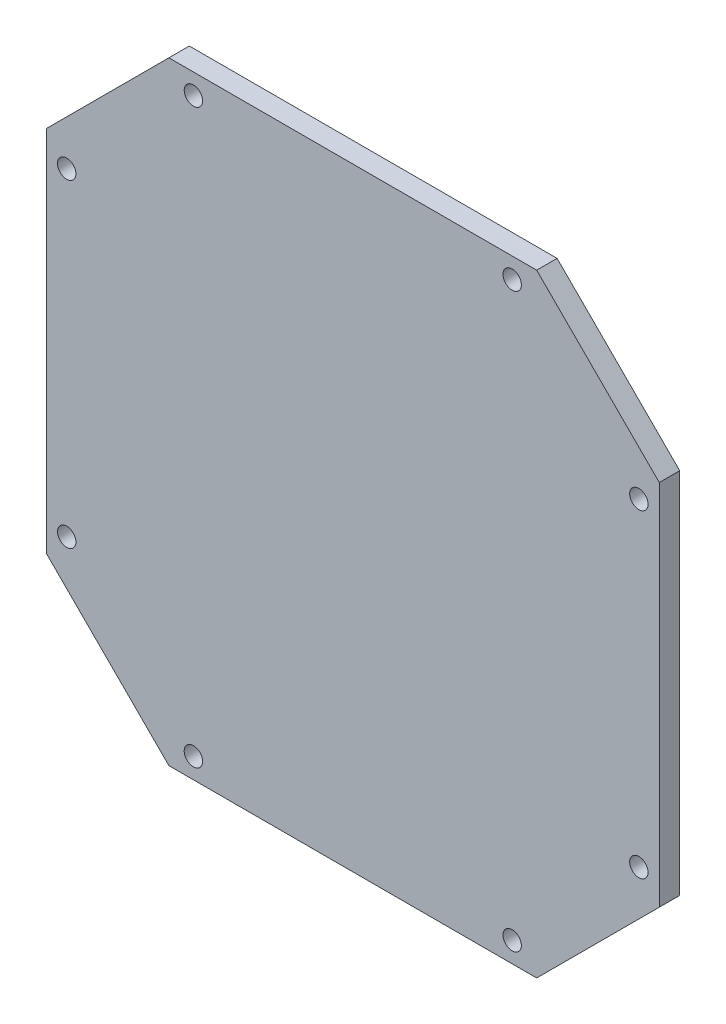
ISO-10303-21;
HEADER;
FILE_DESCRIPTION(('STEP AP214'),'2;1');
FILE_NAME('part.step','',(''),(''),'','','');
FILE_SCHEMA(('AUTOMOTIVE_DESIGN { 1 0 10303 214 1 1 1 1 }'));
ENDSEC;
DATA;
#1=APPLICATION_CONTEXT('core data for automotive mechanical design processes');
#2=APPLICATION_PROTOCOL_DEFINITION('international standard','automotive_design',2000,#1);
#3=PRODUCT_CONTEXT('',#1,'mechanical');
#4=PRODUCT('Part','Part','',(#3));
#5=PRODUCT_RELATED_PRODUCT_CATEGORY('part','',(#4));
#6=PRODUCT_DEFINITION_FORMATION('','',#4);
#7=PRODUCT_DEFINITION_CONTEXT('part definition',#1,'design');
#8=PRODUCT_DEFINITION('design','',#6,#7);
#9=PRODUCT_DEFINITION_SHAPE('','',#8);
#10=(LENGTH_UNIT() NAMED_UNIT(*) SI_UNIT(.MILLI.,.METRE.));
#11=(NAMED_UNIT(*) PLANE_ANGLE_UNIT() SI_UNIT($,.RADIAN.));
#12=(NAMED_UNIT(*) SI_UNIT($,.STERADIAN.) SOLID_ANGLE_UNIT());
#13=UNCERTAINTY_MEASURE_WITH_UNIT(LENGTH_MEASURE(1.E-05),#10,'distance_accuracy_value','');
#14=(GEOMETRIC_REPRESENTATION_CONTEXT(3) GLOBAL_UNCERTAINTY_ASSIGNED_CONTEXT((#13)) GLOBAL_UNIT_ASSIGNED_CONTEXT((#10,
#11,#12)) REPRESENTATION_CONTEXT('',''));
#15=CARTESIAN_POINT('',(0.,0.,0.));
#16=DIRECTION('',(0.,0.,1.));
#17=DIRECTION('',(1.,0.,0.));
#18=AXIS2_PLACEMENT_3D('',#15,#16,#17);
#19=CARTESIAN_POINT('',(0.,60.,10.));
#20=DIRECTION('',(1.,0.,0.));
#21=DIRECTION('',(0.,1.,0.));
#22=AXIS2_PLACEMENT_3D('',#19,#20,#21);
#23=PLANE('',#22);
#24=DIRECTION('',(0.,-1.,0.));
#25=VECTOR('',#24,1.);
#26=CARTESIAN_POINT('',(0.,60.,0.));
#27=LINE('',#26,#25);
#28=CARTESIAN_POINT('',(0.,240.,0.));
#29=VERTEX_POINT('',#28);
#30=CARTESIAN_POINT('',(0.,60.,0.));
#31=VERTEX_POINT('',#30);
#32=EDGE_CURVE('E146',#29,#31,#27,.T.);
#33=ORIENTED_EDGE('',*,*,#32,.T.);
#34=DIRECTION('',(0.,0.,-1.));
#35=VECTOR('',#34,1.);
#36=CARTESIAN_POINT('',(0.,60.,10.));
#37=LINE('',#36,#35);
#38=CARTESIAN_POINT('',(0.,60.,10.));
#39=VERTEX_POINT('',#38);
#40=EDGE_CURVE('E11',#39,#31,#37,.T.);
#41=ORIENTED_EDGE('',*,*,#40,.F.);
#42=DIRECTION('',(0.,-1.,0.));
#43=VECTOR('',#42,1.);
#44=CARTESIAN_POINT('',(0.,60.,10.));
#45=LINE('',#44,#43);
#46=CARTESIAN_POINT('',(0.,240.,10.));
#47=VERTEX_POINT('',#46);
#48=EDGE_CURVE('E169',#47,#39,#45,.T.);
#49=ORIENTED_EDGE('',*,*,#48,.F.);
#50=DIRECTION('',(0.,0.,-1.));
#51=VECTOR('',#50,1.);
#52=CARTESIAN_POINT('',(0.,240.,10.));
#53=LINE('',#52,#51);
#54=EDGE_CURVE('E142',#47,#29,#53,.T.);
#55=ORIENTED_EDGE('',*,*,#54,.T.);
#56=EDGE_LOOP('',(#33,#41,#49,#55));
#57=FACE_BOUND('',#56,.T.);
#58=ADVANCED_FACE('F45',(#57),#23,.F.);
#59=CARTESIAN_POINT('',(59.9999999999998,0.,10.));
#60=DIRECTION('',(0.707106781186548,0.707106781186546,0.));
#61=DIRECTION('',(-0.707106781186547,0.707106781186549,0.));
#62=AXIS2_PLACEMENT_3D('',#59,#60,#61);
#63=PLANE('',#62);
#64=DIRECTION('',(0.707106781186546,-0.707106781186548,0.));
#65=VECTOR('',#64,1.);
#66=CARTESIAN_POINT('',(59.9999999999998,0.,0.));
#67=LINE('',#66,#65);
#68=CARTESIAN_POINT('',(59.9999999999998,0.,0.));
#69=VERTEX_POINT('',#68);
#70=EDGE_CURVE('E150',#31,#69,#67,.T.);
#71=ORIENTED_EDGE('',*,*,#70,.T.);
#72=DIRECTION('',(0.,0.,-1.));
#73=VECTOR('',#72,1.);
#74=CARTESIAN_POINT('',(59.9999999999998,0.,10.));
#75=LINE('',#74,#73);
#76=CARTESIAN_POINT('',(59.9999999999998,0.,10.));
#77=VERTEX_POINT('',#76);
#78=EDGE_CURVE('E54',#77,#69,#75,.T.);
#79=ORIENTED_EDGE('',*,*,#78,.F.);
#80=DIRECTION('',(0.707106781186546,-0.707106781186548,0.));
#81=VECTOR('',#80,1.);
#82=CARTESIAN_POINT('',(59.9999999999998,0.,10.));
#83=LINE('',#82,#81);
#84=EDGE_CURVE('E105',#39,#77,#83,.T.);
#85=ORIENTED_EDGE('',*,*,#84,.F.);
#86=ORIENTED_EDGE('',*,*,#40,.T.);
#87=EDGE_LOOP('',(#71,#79,#85,#86));
#88=FACE_BOUND('',#87,.T.);
#89=ADVANCED_FACE('F314',(#88),#63,.F.);
#90=CARTESIAN_POINT('',(59.9999999999998,0.,10.));
#91=DIRECTION('',(0.,1.,0.));
#92=DIRECTION('',(0.,0.,1.));
#93=AXIS2_PLACEMENT_3D('',#90,#91,#92);
#94=PLANE('',#93);
#95=DIRECTION('',(1.,0.,0.));
#96=VECTOR('',#95,1.);
#97=CARTESIAN_POINT('',(59.9999999999998,0.,0.));
#98=LINE('',#97,#96);
#99=CARTESIAN_POINT('',(240.,0.,0.));
#100=VERTEX_POINT('',#99);
#101=EDGE_CURVE('E154',#69,#100,#98,.T.);
#102=ORIENTED_EDGE('',*,*,#101,.T.);
#103=DIRECTION('',(0.,0.,-1.));
#104=VECTOR('',#103,1.);
#105=CARTESIAN_POINT('',(240.,0.,10.));
#106=LINE('',#105,#104);
#107=CARTESIAN_POINT('',(240.,0.,10.));
#108=VERTEX_POINT('',#107);
#109=EDGE_CURVE('E180',#108,#100,#106,.T.);
#110=ORIENTED_EDGE('',*,*,#109,.F.);
#111=DIRECTION('',(1.,0.,0.));
#112=VECTOR('',#111,1.);
#113=CARTESIAN_POINT('',(59.9999999999998,0.,10.));
#114=LINE('',#113,#112);
#115=EDGE_CURVE('E190',#77,#108,#114,.T.);
#116=ORIENTED_EDGE('',*,*,#115,.F.);
#117=ORIENTED_EDGE('',*,*,#78,.T.);
#118=EDGE_LOOP('',(#102,#110,#116,#117));
#119=FACE_BOUND('',#118,.T.);
#120=ADVANCED_FACE('F188',(#119),#94,.F.);
#121=CARTESIAN_POINT('',(240.,0.,10.));
#122=DIRECTION('',(-0.707106781186548,0.707106781186547,0.));
#123=DIRECTION('',(-0.707106781186547,-0.707106781186548,0.));
#124=AXIS2_PLACEMENT_3D('',#121,#122,#123);
#125=PLANE('',#124);
#126=DIRECTION('',(0.707106781186547,0.707106781186548,0.));
#127=VECTOR('',#126,1.);
#128=CARTESIAN_POINT('',(240.,0.,0.));
#129=LINE('',#128,#127);
#130=CARTESIAN_POINT('',(300.,60.,0.));
#131=VERTEX_POINT('',#130);
#132=EDGE_CURVE('E157',#100,#131,#129,.T.);
#133=ORIENTED_EDGE('',*,*,#132,.T.);
#134=DIRECTION('',(0.,0.,-1.));
#135=VECTOR('',#134,1.);
#136=CARTESIAN_POINT('',(300.,60.,10.));
#137=LINE('',#136,#135);
#138=CARTESIAN_POINT('',(300.,60.,10.));
#139=VERTEX_POINT('',#138);
#140=EDGE_CURVE('E176',#139,#131,#137,.T.);
#141=ORIENTED_EDGE('',*,*,#140,.F.);
#142=DIRECTION('',(0.707106781186547,0.707106781186548,0.));
#143=VECTOR('',#142,1.);
#144=CARTESIAN_POINT('',(240.,0.,10.));
#145=LINE('',#144,#143);
#146=EDGE_CURVE('E203',#108,#139,#145,.T.);
#147=ORIENTED_EDGE('',*,*,#146,.F.);
#148=ORIENTED_EDGE('',*,*,#109,.T.);
#149=EDGE_LOOP('',(#133,#141,#147,#148));
#150=FACE_BOUND('',#149,.T.);
#151=ADVANCED_FACE('F198',(#150),#125,.F.);
#152=CARTESIAN_POINT('',(300.,60.,10.));
#153=DIRECTION('',(-1.,0.,0.));
#154=DIRECTION('',(0.,0.,1.));
#155=AXIS2_PLACEMENT_3D('',#152,#153,#154);
#156=PLANE('',#155);
#157=DIRECTION('',(0.,1.,0.));
#158=VECTOR('',#157,1.);
#159=CARTESIAN_POINT('',(300.,60.,0.));
#160=LINE('',#159,#158);
#161=CARTESIAN_POINT('',(300.,240.,0.));
#162=VERTEX_POINT('',#161);
#163=EDGE_CURVE('E160',#131,#162,#160,.T.);
#164=ORIENTED_EDGE('',*,*,#163,.T.);
#165=DIRECTION('',(0.,0.,-1.));
#166=VECTOR('',#165,1.);
#167=CARTESIAN_POINT('',(300.,240.,10.));
#168=LINE('',#167,#166);
#169=CARTESIAN_POINT('',(300.,240.,10.));
#170=VERTEX_POINT('',#169);
#171=EDGE_CURVE('E135',#170,#162,#168,.T.);
#172=ORIENTED_EDGE('',*,*,#171,.F.);
#173=DIRECTION('',(0.,1.,0.));
#174=VECTOR('',#173,1.);
#175=CARTESIAN_POINT('',(300.,60.,10.));
#176=LINE('',#175,#174);
#177=EDGE_CURVE('E124',#139,#170,#176,.T.);
#178=ORIENTED_EDGE('',*,*,#177,.F.);
#179=ORIENTED_EDGE('',*,*,#140,.T.);
#180=EDGE_LOOP('',(#164,#172,#178,#179));
#181=FACE_BOUND('',#180,.T.);
#182=ADVANCED_FACE('F201',(#181),#156,.F.);
#183=CARTESIAN_POINT('',(240.,300.,10.));
#184=DIRECTION('',(-0.707106781186546,-0.707106781186549,0.));
#185=DIRECTION('',(0.707106781186549,-0.707106781186546,0.));
#186=AXIS2_PLACEMENT_3D('',#183,#184,#185);
#187=PLANE('',#186);
#188=DIRECTION('',(-0.707106781186549,0.707106781186546,0.));
#189=VECTOR('',#188,1.);
#190=CARTESIAN_POINT('',(240.,300.,0.));
#191=LINE('',#190,#189);
#192=CARTESIAN_POINT('',(240.,300.,0.));
#193=VERTEX_POINT('',#192);
#194=EDGE_CURVE('E133',#162,#193,#191,.T.);
#195=ORIENTED_EDGE('',*,*,#194,.T.);
#196=DIRECTION('',(0.,0.,-1.));
#197=VECTOR('',#196,1.);
#198=CARTESIAN_POINT('',(240.,300.,10.));
#199=LINE('',#198,#197);
#200=CARTESIAN_POINT('',(240.,300.,10.));
#201=VERTEX_POINT('',#200);
#202=EDGE_CURVE('E130',#201,#193,#199,.T.);
#203=ORIENTED_EDGE('',*,*,#202,.F.);
#204=DIRECTION('',(-0.707106781186549,0.707106781186546,0.));
#205=VECTOR('',#204,1.);
#206=CARTESIAN_POINT('',(240.,300.,10.));
#207=LINE('',#206,#205);
#208=EDGE_CURVE('E118',#170,#201,#207,.T.);
#209=ORIENTED_EDGE('',*,*,#208,.F.);
#210=ORIENTED_EDGE('',*,*,#171,.T.);
#211=EDGE_LOOP('',(#195,#203,#209,#210));
#212=FACE_BOUND('',#211,.T.);
#213=ADVANCED_FACE('F131',(#212),#187,.F.);
#214=CARTESIAN_POINT('',(59.9999999999999,300.,10.));
#215=DIRECTION('',(0.,-1.,0.));
#216=DIRECTION('',(0.,0.,-1.));
#217=AXIS2_PLACEMENT_3D('',#214,#215,#216);
#218=PLANE('',#217);
#219=DIRECTION('',(-1.,0.,0.));
#220=VECTOR('',#219,1.);
#221=CARTESIAN_POINT('',(59.9999999999999,300.,0.));
#222=LINE('',#221,#220);
#223=CARTESIAN_POINT('',(59.9999999999999,300.,0.));
#224=VERTEX_POINT('',#223);
#225=EDGE_CURVE('E91',#193,#224,#222,.T.);
#226=ORIENTED_EDGE('',*,*,#225,.T.);
#227=DIRECTION('',(0.,0.,-1.));
#228=VECTOR('',#227,1.);
#229=CARTESIAN_POINT('',(59.9999999999999,300.,10.));
#230=LINE('',#229,#228);
#231=CARTESIAN_POINT('',(59.9999999999999,300.,10.));
#232=VERTEX_POINT('',#231);
#233=EDGE_CURVE('E136',#232,#224,#230,.T.);
#234=ORIENTED_EDGE('',*,*,#233,.F.);
#235=DIRECTION('',(-1.,0.,0.));
#236=VECTOR('',#235,1.);
#237=CARTESIAN_POINT('',(59.9999999999999,300.,10.));
#238=LINE('',#237,#236);
#239=EDGE_CURVE('E122',#201,#232,#238,.T.);
#240=ORIENTED_EDGE('',*,*,#239,.F.);
#241=ORIENTED_EDGE('',*,*,#202,.T.);
#242=EDGE_LOOP('',(#226,#234,#240,#241));
#243=FACE_BOUND('',#242,.T.);
#244=ADVANCED_FACE('F138',(#243),#218,.F.);
#245=CARTESIAN_POINT('',(0.,240.,10.));
#246=DIRECTION('',(0.707106781186547,-0.707106781186548,0.));
#247=DIRECTION('',(0.707106781186548,0.707106781186547,0.));
#248=AXIS2_PLACEMENT_3D('',#245,#246,#247);
#249=PLANE('',#248);
#250=DIRECTION('',(-0.707106781186548,-0.707106781186547,0.));
#251=VECTOR('',#250,1.);
#252=CARTESIAN_POINT('',(0.,240.,0.));
#253=LINE('',#252,#251);
#254=EDGE_CURVE('E97',#224,#29,#253,.T.);
#255=ORIENTED_EDGE('',*,*,#254,.T.);
#256=ORIENTED_EDGE('',*,*,#54,.F.);
#257=DIRECTION('',(-0.707106781186548,-0.707106781186547,0.));
#258=VECTOR('',#257,1.);
#259=CARTESIAN_POINT('',(0.,240.,10.));
#260=LINE('',#259,#258);
#261=EDGE_CURVE('E62',#232,#47,#260,.T.);
#262=ORIENTED_EDGE('',*,*,#261,.F.);
#263=ORIENTED_EDGE('',*,*,#233,.T.);
#264=EDGE_LOOP('',(#255,#256,#262,#263));
#265=FACE_BOUND('',#264,.T.);
#266=ADVANCED_FACE('F281',(#265),#249,.F.);
#267=CARTESIAN_POINT('',(0.,0.,10.));
#268=DIRECTION('',(0.,0.,-1.));
#269=DIRECTION('',(-1.,0.,0.));
#270=AXIS2_PLACEMENT_3D('',#267,#268,#269);
#271=PLANE('',#270);
#272=CARTESIAN_POINT('',(10.,72.,10.));
#273=DIRECTION('',(0.,0.,1.));
#274=DIRECTION('',(1.,0.,0.));
#275=AXIS2_PLACEMENT_3D('',#272,#273,#274);
#276=CIRCLE('',#275,4.5);
#277=CARTESIAN_POINT('',(14.5,72.,10.));
#278=VERTEX_POINT('',#277);
#279=EDGE_CURVE('E272',#278,#278,#276,.T.);
#280=ORIENTED_EDGE('',*,*,#279,.F.);
#281=EDGE_LOOP('',(#280));
#282=FACE_BOUND('',#281,.T.);
#283=CARTESIAN_POINT('',(290.,72.,10.));
#284=DIRECTION('',(0.,0.,1.));
#285=DIRECTION('',(1.,0.,0.));
#286=AXIS2_PLACEMENT_3D('',#283,#284,#285);
#287=CIRCLE('',#286,4.5);
#288=CARTESIAN_POINT('',(294.5,72.,10.));
#289=VERTEX_POINT('',#288);
#290=EDGE_CURVE('E264',#289,#289,#287,.T.);
#291=ORIENTED_EDGE('',*,*,#290,.F.);
#292=EDGE_LOOP('',(#291));
#293=FACE_BOUND('',#292,.T.);
#294=CARTESIAN_POINT('',(228.,10.,10.));
#295=DIRECTION('',(0.,0.,1.));
#296=DIRECTION('',(1.,0.,0.));
#297=AXIS2_PLACEMENT_3D('',#294,#295,#296);
#298=CIRCLE('',#297,4.5);
#299=CARTESIAN_POINT('',(232.5,10.,10.));
#300=VERTEX_POINT('',#299);
#301=EDGE_CURVE('E256',#300,#300,#298,.T.);
#302=ORIENTED_EDGE('',*,*,#301,.F.);
#303=EDGE_LOOP('',(#302));
#304=FACE_BOUND('',#303,.T.);
#305=CARTESIAN_POINT('',(72.,10.,10.));
#306=DIRECTION('',(0.,0.,1.));
#307=DIRECTION('',(1.,0.,0.));
#308=AXIS2_PLACEMENT_3D('',#305,#306,#307);
#309=CIRCLE('',#308,4.5);
#310=CARTESIAN_POINT('',(76.5,10.,10.));
#311=VERTEX_POINT('',#310);
#312=EDGE_CURVE('E248',#311,#311,#309,.T.);
#313=ORIENTED_EDGE('',*,*,#312,.F.);
#314=EDGE_LOOP('',(#313));
#315=FACE_BOUND('',#314,.T.);
#316=CARTESIAN_POINT('',(10.,228.,10.));
#317=DIRECTION('',(0.,0.,1.));
#318=DIRECTION('',(1.,0.,0.));
#319=AXIS2_PLACEMENT_3D('',#316,#317,#318);
#320=CIRCLE('',#319,4.5);
#321=CARTESIAN_POINT('',(14.5,228.,10.));
#322=VERTEX_POINT('',#321);
#323=EDGE_CURVE('E240',#322,#322,#320,.T.);
#324=ORIENTED_EDGE('',*,*,#323,.F.);
#325=EDGE_LOOP('',(#324));
#326=FACE_BOUND('',#325,.T.);
#327=CARTESIAN_POINT('',(290.,228.,10.));
#328=DIRECTION('',(0.,0.,1.));
#329=DIRECTION('',(1.,0.,0.));
#330=AXIS2_PLACEMENT_3D('',#327,#328,#329);
#331=CIRCLE('',#330,4.5);
#332=CARTESIAN_POINT('',(294.5,228.,10.));
#333=VERTEX_POINT('',#332);
#334=EDGE_CURVE('E232',#333,#333,#331,.T.);
#335=ORIENTED_EDGE('',*,*,#334,.F.);
#336=EDGE_LOOP('',(#335));
#337=FACE_BOUND('',#336,.T.);
#338=CARTESIAN_POINT('',(228.,290.,10.));
#339=DIRECTION('',(0.,0.,1.));
#340=DIRECTION('',(1.,0.,0.));
#341=AXIS2_PLACEMENT_3D('',#338,#339,#340);
#342=CIRCLE('',#341,4.5);
#343=CARTESIAN_POINT('',(232.5,290.,10.));
#344=VERTEX_POINT('',#343);
#345=EDGE_CURVE('E224',#344,#344,#342,.T.);
#346=ORIENTED_EDGE('',*,*,#345,.F.);
#347=EDGE_LOOP('',(#346));
#348=FACE_BOUND('',#347,.T.);
#349=CARTESIAN_POINT('',(72.,290.,10.));
#350=DIRECTION('',(0.,0.,1.));
#351=DIRECTION('',(1.,0.,0.));
#352=AXIS2_PLACEMENT_3D('',#349,#350,#351);
#353=CIRCLE('',#352,4.5);
#354=CARTESIAN_POINT('',(76.5,290.,10.));
#355=VERTEX_POINT('',#354);
#356=EDGE_CURVE('E216',#355,#355,#353,.T.);
#357=ORIENTED_EDGE('',*,*,#356,.F.);
#358=EDGE_LOOP('',(#357));
#359=FACE_BOUND('',#358,.T.);
#360=ORIENTED_EDGE('',*,*,#48,.T.);
#361=ORIENTED_EDGE('',*,*,#84,.T.);
#362=ORIENTED_EDGE('',*,*,#115,.T.);
#363=ORIENTED_EDGE('',*,*,#146,.T.);
#364=ORIENTED_EDGE('',*,*,#177,.T.);
#365=ORIENTED_EDGE('',*,*,#208,.T.);
#366=ORIENTED_EDGE('',*,*,#239,.T.);
#367=ORIENTED_EDGE('',*,*,#261,.T.);
#368=EDGE_LOOP('',(#360,#361,#362,#363,#364,#365,#366,#367));
#369=FACE_BOUND('',#368,.T.);
#370=ADVANCED_FACE('F120',(#282,#293,#304,#315,#326,#337,#348,#359,#369),#271,.F.);
#371=CARTESIAN_POINT('',(0.,0.,0.));
#372=DIRECTION('',(0.,0.,-1.));
#373=DIRECTION('',(-1.,0.,0.));
#374=AXIS2_PLACEMENT_3D('',#371,#372,#373);
#375=PLANE('',#374);
#376=CARTESIAN_POINT('',(10.,72.,0.));
#377=DIRECTION('',(0.,0.,1.));
#378=DIRECTION('',(1.,0.,0.));
#379=AXIS2_PLACEMENT_3D('',#376,#377,#378);
#380=CIRCLE('',#379,4.5);
#381=CARTESIAN_POINT('',(14.5,72.,0.));
#382=VERTEX_POINT('',#381);
#383=EDGE_CURVE('E268',#382,#382,#380,.T.);
#384=ORIENTED_EDGE('',*,*,#383,.T.);
#385=EDGE_LOOP('',(#384));
#386=FACE_BOUND('',#385,.T.);
#387=CARTESIAN_POINT('',(290.,72.,0.));
#388=DIRECTION('',(0.,0.,1.));
#389=DIRECTION('',(1.,0.,0.));
#390=AXIS2_PLACEMENT_3D('',#387,#388,#389);
#391=CIRCLE('',#390,4.5);
#392=CARTESIAN_POINT('',(294.5,72.,0.));
#393=VERTEX_POINT('',#392);
#394=EDGE_CURVE('E260',#393,#393,#391,.T.);
#395=ORIENTED_EDGE('',*,*,#394,.T.);
#396=EDGE_LOOP('',(#395));
#397=FACE_BOUND('',#396,.T.);
#398=CARTESIAN_POINT('',(228.,10.,0.));
#399=DIRECTION('',(0.,0.,1.));
#400=DIRECTION('',(1.,0.,0.));
#401=AXIS2_PLACEMENT_3D('',#398,#399,#400);
#402=CIRCLE('',#401,4.5);
#403=CARTESIAN_POINT('',(232.5,10.,0.));
#404=VERTEX_POINT('',#403);
#405=EDGE_CURVE('E252',#404,#404,#402,.T.);
#406=ORIENTED_EDGE('',*,*,#405,.T.);
#407=EDGE_LOOP('',(#406));
#408=FACE_BOUND('',#407,.T.);
#409=CARTESIAN_POINT('',(72.,10.,0.));
#410=DIRECTION('',(0.,0.,1.));
#411=DIRECTION('',(1.,0.,0.));
#412=AXIS2_PLACEMENT_3D('',#409,#410,#411);
#413=CIRCLE('',#412,4.5);
#414=CARTESIAN_POINT('',(76.5,10.,0.));
#415=VERTEX_POINT('',#414);
#416=EDGE_CURVE('E244',#415,#415,#413,.T.);
#417=ORIENTED_EDGE('',*,*,#416,.T.);
#418=EDGE_LOOP('',(#417));
#419=FACE_BOUND('',#418,.T.);
#420=CARTESIAN_POINT('',(10.,228.,0.));
#421=DIRECTION('',(0.,0.,1.));
#422=DIRECTION('',(1.,0.,0.));
#423=AXIS2_PLACEMENT_3D('',#420,#421,#422);
#424=CIRCLE('',#423,4.5);
#425=CARTESIAN_POINT('',(14.5,228.,0.));
#426=VERTEX_POINT('',#425);
#427=EDGE_CURVE('E236',#426,#426,#424,.T.);
#428=ORIENTED_EDGE('',*,*,#427,.T.);
#429=EDGE_LOOP('',(#428));
#430=FACE_BOUND('',#429,.T.);
#431=CARTESIAN_POINT('',(290.,228.,0.));
#432=DIRECTION('',(0.,0.,1.));
#433=DIRECTION('',(1.,0.,0.));
#434=AXIS2_PLACEMENT_3D('',#431,#432,#433);
#435=CIRCLE('',#434,4.5);
#436=CARTESIAN_POINT('',(294.5,228.,0.));
#437=VERTEX_POINT('',#436);
#438=EDGE_CURVE('E228',#437,#437,#435,.T.);
#439=ORIENTED_EDGE('',*,*,#438,.T.);
#440=EDGE_LOOP('',(#439));
#441=FACE_BOUND('',#440,.T.);
#442=CARTESIAN_POINT('',(228.,290.,0.));
#443=DIRECTION('',(0.,0.,1.));
#444=DIRECTION('',(1.,0.,0.));
#445=AXIS2_PLACEMENT_3D('',#442,#443,#444);
#446=CIRCLE('',#445,4.5);
#447=CARTESIAN_POINT('',(232.5,290.,0.));
#448=VERTEX_POINT('',#447);
#449=EDGE_CURVE('E220',#448,#448,#446,.T.);
#450=ORIENTED_EDGE('',*,*,#449,.T.);
#451=EDGE_LOOP('',(#450));
#452=FACE_BOUND('',#451,.T.);
#453=CARTESIAN_POINT('',(72.,290.,0.));
#454=DIRECTION('',(0.,0.,1.));
#455=DIRECTION('',(1.,0.,0.));
#456=AXIS2_PLACEMENT_3D('',#453,#454,#455);
#457=CIRCLE('',#456,4.5);
#458=CARTESIAN_POINT('',(76.5,290.,0.));
#459=VERTEX_POINT('',#458);
#460=EDGE_CURVE('E151',#459,#459,#457,.T.);
#461=ORIENTED_EDGE('',*,*,#460,.T.);
#462=EDGE_LOOP('',(#461));
#463=FACE_BOUND('',#462,.T.);
#464=ORIENTED_EDGE('',*,*,#32,.F.);
#465=ORIENTED_EDGE('',*,*,#254,.F.);
#466=ORIENTED_EDGE('',*,*,#225,.F.);
#467=ORIENTED_EDGE('',*,*,#194,.F.);
#468=ORIENTED_EDGE('',*,*,#163,.F.);
#469=ORIENTED_EDGE('',*,*,#132,.F.);
#470=ORIENTED_EDGE('',*,*,#101,.F.);
#471=ORIENTED_EDGE('',*,*,#70,.F.);
#472=EDGE_LOOP('',(#464,#465,#466,#467,#468,#469,#470,#471));
#473=FACE_BOUND('',#472,.T.);
#474=ADVANCED_FACE('F194',(#386,#397,#408,#419,#430,#441,#452,#463,#473),#375,.T.);
#475=CARTESIAN_POINT('',(72.,290.,10.));
#476=DIRECTION('',(0.,0.,1.));
#477=DIRECTION('',(1.,0.,0.));
#478=AXIS2_PLACEMENT_3D('',#475,#476,#477);
#479=CYLINDRICAL_SURFACE('',#478,4.5);
#480=ORIENTED_EDGE('',*,*,#460,.F.);
#481=EDGE_LOOP('',(#480));
#482=FACE_BOUND('',#481,.T.);
#483=ORIENTED_EDGE('',*,*,#356,.T.);
#484=EDGE_LOOP('',(#483));
#485=FACE_BOUND('',#484,.T.);
#486=ADVANCED_FACE('F297',(#482,#485),#479,.F.);
#487=CARTESIAN_POINT('',(228.,290.,10.));
#488=DIRECTION('',(0.,0.,1.));
#489=DIRECTION('',(1.,0.,0.));
#490=AXIS2_PLACEMENT_3D('',#487,#488,#489);
#491=CYLINDRICAL_SURFACE('',#490,4.5);
#492=ORIENTED_EDGE('',*,*,#449,.F.);
#493=EDGE_LOOP('',(#492));
#494=FACE_BOUND('',#493,.T.);
#495=ORIENTED_EDGE('',*,*,#345,.T.);
#496=EDGE_LOOP('',(#495));
#497=FACE_BOUND('',#496,.T.);
#498=ADVANCED_FACE('F299',(#494,#497),#491,.F.);
#499=CARTESIAN_POINT('',(290.,228.,10.));
#500=DIRECTION('',(0.,0.,1.));
#501=DIRECTION('',(1.,0.,0.));
#502=AXIS2_PLACEMENT_3D('',#499,#500,#501);
#503=CYLINDRICAL_SURFACE('',#502,4.5);
#504=ORIENTED_EDGE('',*,*,#438,.F.);
#505=EDGE_LOOP('',(#504));
#506=FACE_BOUND('',#505,.T.);
#507=ORIENTED_EDGE('',*,*,#334,.T.);
#508=EDGE_LOOP('',(#507));
#509=FACE_BOUND('',#508,.T.);
#510=ADVANCED_FACE('F306',(#506,#509),#503,.F.);
#511=CARTESIAN_POINT('',(10.,228.,10.));
#512=DIRECTION('',(0.,0.,1.));
#513=DIRECTION('',(1.,0.,0.));
#514=AXIS2_PLACEMENT_3D('',#511,#512,#513);
#515=CYLINDRICAL_SURFACE('',#514,4.5);
#516=ORIENTED_EDGE('',*,*,#427,.F.);
#517=EDGE_LOOP('',(#516));
#518=FACE_BOUND('',#517,.T.);
#519=ORIENTED_EDGE('',*,*,#323,.T.);
#520=EDGE_LOOP('',(#519));
#521=FACE_BOUND('',#520,.T.);
#522=ADVANCED_FACE('F396',(#518,#521),#515,.F.);
#523=CARTESIAN_POINT('',(72.,10.,10.));
#524=DIRECTION('',(0.,0.,1.));
#525=DIRECTION('',(1.,0.,0.));
#526=AXIS2_PLACEMENT_3D('',#523,#524,#525);
#527=CYLINDRICAL_SURFACE('',#526,4.5);
#528=ORIENTED_EDGE('',*,*,#416,.F.);
#529=EDGE_LOOP('',(#528));
#530=FACE_BOUND('',#529,.T.);
#531=ORIENTED_EDGE('',*,*,#312,.T.);
#532=EDGE_LOOP('',(#531));
#533=FACE_BOUND('',#532,.T.);
#534=ADVANCED_FACE('F405',(#530,#533),#527,.F.);
#535=CARTESIAN_POINT('',(228.,10.,10.));
#536=DIRECTION('',(0.,0.,1.));
#537=DIRECTION('',(1.,0.,0.));
#538=AXIS2_PLACEMENT_3D('',#535,#536,#537);
#539=CYLINDRICAL_SURFACE('',#538,4.5);
#540=ORIENTED_EDGE('',*,*,#405,.F.);
#541=EDGE_LOOP('',(#540));
#542=FACE_BOUND('',#541,.T.);
#543=ORIENTED_EDGE('',*,*,#301,.T.);
#544=EDGE_LOOP('',(#543));
#545=FACE_BOUND('',#544,.T.);
#546=ADVANCED_FACE('F414',(#542,#545),#539,.F.);
#547=CARTESIAN_POINT('',(290.,72.,10.));
#548=DIRECTION('',(0.,0.,1.));
#549=DIRECTION('',(1.,0.,0.));
#550=AXIS2_PLACEMENT_3D('',#547,#548,#549);
#551=CYLINDRICAL_SURFACE('',#550,4.5);
#552=ORIENTED_EDGE('',*,*,#394,.F.);
#553=EDGE_LOOP('',(#552));
#554=FACE_BOUND('',#553,.T.);
#555=ORIENTED_EDGE('',*,*,#290,.T.);
#556=EDGE_LOOP('',(#555));
#557=FACE_BOUND('',#556,.T.);
#558=ADVANCED_FACE('F424',(#554,#557),#551,.F.);
#559=CARTESIAN_POINT('',(10.,72.,10.));
#560=DIRECTION('',(0.,0.,1.));
#561=DIRECTION('',(1.,0.,0.));
#562=AXIS2_PLACEMENT_3D('',#559,#560,#561);
#563=CYLINDRICAL_SURFACE('',#562,4.5);
#564=ORIENTED_EDGE('',*,*,#383,.F.);
#565=EDGE_LOOP('',(#564));
#566=FACE_BOUND('',#565,.T.);
#567=ORIENTED_EDGE('',*,*,#279,.T.);
#568=EDGE_LOOP('',(#567));
#569=FACE_BOUND('',#568,.T.);
#570=ADVANCED_FACE('F277',(#566,#569),#563,.F.);
#571=CLOSED_SHELL('',(#58,#89,#120,#151,#182,#213,#244,#266,#370,#474,#486,#498,#510,#522,#534,
#546,#558,#570));
#572=MANIFOLD_SOLID_BREP('B2',#571);
#573=ADVANCED_BREP_SHAPE_REPRESENTATION('',(#18,#572),#14);
#574=SHAPE_DEFINITION_REPRESENTATION(#9,#573);
ENDSEC;
END-ISO-10303-21;
